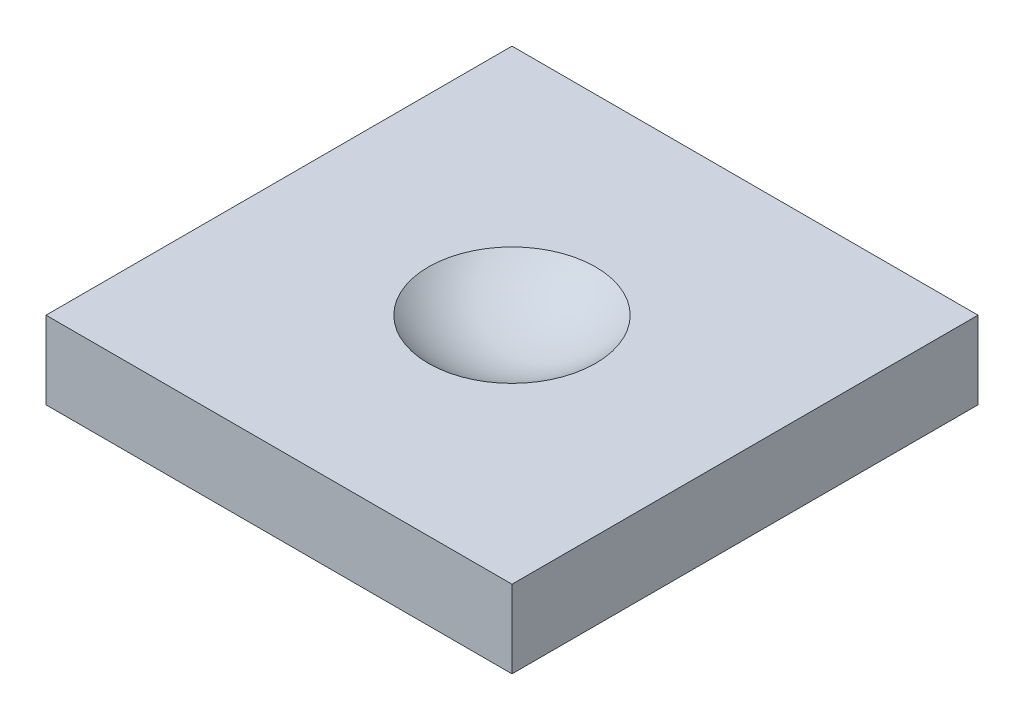
ISO-10303-21;
HEADER;
FILE_DESCRIPTION(('STEP AP214'),'2;1');
FILE_NAME('part.step','',(''),(''),'','','');
FILE_SCHEMA(('AUTOMOTIVE_DESIGN { 1 0 10303 214 1 1 1 1 }'));
ENDSEC;
DATA;
#1=APPLICATION_CONTEXT('core data for automotive mechanical design processes');
#2=APPLICATION_PROTOCOL_DEFINITION('international standard','automotive_design',2000,#1);
#3=PRODUCT_CONTEXT('',#1,'mechanical');
#4=PRODUCT('Part','Part','',(#3));
#5=PRODUCT_RELATED_PRODUCT_CATEGORY('part','',(#4));
#6=PRODUCT_DEFINITION_FORMATION('','',#4);
#7=PRODUCT_DEFINITION_CONTEXT('part definition',#1,'design');
#8=PRODUCT_DEFINITION('design','',#6,#7);
#9=PRODUCT_DEFINITION_SHAPE('','',#8);
#10=(LENGTH_UNIT() NAMED_UNIT(*) SI_UNIT(.MILLI.,.METRE.));
#11=(NAMED_UNIT(*) PLANE_ANGLE_UNIT() SI_UNIT($,.RADIAN.));
#12=(NAMED_UNIT(*) SI_UNIT($,.STERADIAN.) SOLID_ANGLE_UNIT());
#13=UNCERTAINTY_MEASURE_WITH_UNIT(LENGTH_MEASURE(1.E-05),#10,'distance_accuracy_value','');
#14=(GEOMETRIC_REPRESENTATION_CONTEXT(3) GLOBAL_UNCERTAINTY_ASSIGNED_CONTEXT((#13)) GLOBAL_UNIT_ASSIGNED_CONTEXT((#10,
#11,#12)) REPRESENTATION_CONTEXT('',''));
#15=CARTESIAN_POINT('',(0.,0.,0.));
#16=DIRECTION('',(0.,0.,1.));
#17=DIRECTION('',(1.,0.,0.));
#18=AXIS2_PLACEMENT_3D('',#15,#16,#17);
#19=CARTESIAN_POINT('',(0.,0.,0.));
#20=DIRECTION('',(0.,1.,0.));
#21=DIRECTION('',(0.,0.,1.));
#22=AXIS2_PLACEMENT_3D('',#19,#20,#21);
#23=PLANE('',#22);
#24=DIRECTION('',(1.,0.,0.));
#25=VECTOR('',#24,1.);
#26=CARTESIAN_POINT('',(-60.,0.,60.));
#27=LINE('',#26,#25);
#28=CARTESIAN_POINT('',(-60.,0.,60.));
#29=VERTEX_POINT('',#28);
#30=CARTESIAN_POINT('',(60.,0.,60.));
#31=VERTEX_POINT('',#30);
#32=EDGE_CURVE('E147',#29,#31,#27,.T.);
#33=ORIENTED_EDGE('',*,*,#32,.F.);
#34=DIRECTION('',(0.,0.,-1.));
#35=VECTOR('',#34,1.);
#36=CARTESIAN_POINT('',(-60.,0.,60.));
#37=LINE('',#36,#35);
#38=CARTESIAN_POINT('',(-60.,0.,-60.));
#39=VERTEX_POINT('',#38);
#40=EDGE_CURVE('E155',#29,#39,#37,.T.);
#41=ORIENTED_EDGE('',*,*,#40,.T.);
#42=DIRECTION('',(1.,0.,0.));
#43=VECTOR('',#42,1.);
#44=CARTESIAN_POINT('',(-60.,0.,-60.));
#45=LINE('',#44,#43);
#46=CARTESIAN_POINT('',(60.,0.,-60.));
#47=VERTEX_POINT('',#46);
#48=EDGE_CURVE('E171',#39,#47,#45,.T.);
#49=ORIENTED_EDGE('',*,*,#48,.T.);
#50=DIRECTION('',(0.,0.,-1.));
#51=VECTOR('',#50,1.);
#52=CARTESIAN_POINT('',(60.,0.,60.));
#53=LINE('',#52,#51);
#54=EDGE_CURVE('E167',#31,#47,#53,.T.);
#55=ORIENTED_EDGE('',*,*,#54,.F.);
#56=EDGE_LOOP('',(#33,#41,#49,#55));
#57=FACE_BOUND('',#56,.T.);
#58=DIRECTION('',(-1.,0.,0.));
#59=VECTOR('',#58,1.);
#60=CARTESIAN_POINT('',(49.925,0.,-49.95));
#61=LINE('',#60,#59);
#62=CARTESIAN_POINT('',(49.925,0.,-49.95));
#63=VERTEX_POINT('',#62);
#64=CARTESIAN_POINT('',(-49.925,0.,-49.95));
#65=VERTEX_POINT('',#64);
#66=EDGE_CURVE('E60',#63,#65,#61,.T.);
#67=ORIENTED_EDGE('',*,*,#66,.T.);
#68=DIRECTION('',(0.,0.,1.));
#69=VECTOR('',#68,1.);
#70=CARTESIAN_POINT('',(-49.925,0.,-49.95));
#71=LINE('',#70,#69);
#72=CARTESIAN_POINT('',(-49.925,0.,49.95));
#73=VERTEX_POINT('',#72);
#74=EDGE_CURVE('E140',#65,#73,#71,.T.);
#75=ORIENTED_EDGE('',*,*,#74,.T.);
#76=DIRECTION('',(-1.,0.,0.));
#77=VECTOR('',#76,1.);
#78=CARTESIAN_POINT('',(49.925,0.,49.95));
#79=LINE('',#78,#77);
#80=CARTESIAN_POINT('',(49.925,0.,49.95));
#81=VERTEX_POINT('',#80);
#82=EDGE_CURVE('E325',#81,#73,#79,.T.);
#83=ORIENTED_EDGE('',*,*,#82,.F.);
#84=DIRECTION('',(0.,0.,1.));
#85=VECTOR('',#84,1.);
#86=CARTESIAN_POINT('',(49.925,0.,-49.95));
#87=LINE('',#86,#85);
#88=EDGE_CURVE('E136',#63,#81,#87,.T.);
#89=ORIENTED_EDGE('',*,*,#88,.F.);
#90=EDGE_LOOP('',(#67,#75,#83,#89));
#91=FACE_BOUND('',#90,.T.);
#92=ADVANCED_FACE('F43',(#57,#91),#23,.F.);
#93=CARTESIAN_POINT('',(-60.,20.,60.));
#94=DIRECTION('',(0.,0.,-1.));
#95=DIRECTION('',(-1.,0.,0.));
#96=AXIS2_PLACEMENT_3D('',#93,#94,#95);
#97=PLANE('',#96);
#98=ORIENTED_EDGE('',*,*,#32,.T.);
#99=DIRECTION('',(0.,-1.,0.));
#100=VECTOR('',#99,1.);
#101=CARTESIAN_POINT('',(60.,20.,60.));
#102=LINE('',#101,#100);
#103=CARTESIAN_POINT('',(60.,20.,60.));
#104=VERTEX_POINT('',#103);
#105=EDGE_CURVE('E11',#104,#31,#102,.T.);
#106=ORIENTED_EDGE('',*,*,#105,.F.);
#107=DIRECTION('',(1.,0.,0.));
#108=VECTOR('',#107,1.);
#109=CARTESIAN_POINT('',(-60.,20.,60.));
#110=LINE('',#109,#108);
#111=CARTESIAN_POINT('',(-60.,20.,60.));
#112=VERTEX_POINT('',#111);
#113=EDGE_CURVE('E152',#112,#104,#110,.T.);
#114=ORIENTED_EDGE('',*,*,#113,.F.);
#115=DIRECTION('',(0.,-1.,0.));
#116=VECTOR('',#115,1.);
#117=CARTESIAN_POINT('',(-60.,20.,60.));
#118=LINE('',#117,#116);
#119=EDGE_CURVE('E69',#112,#29,#118,.T.);
#120=ORIENTED_EDGE('',*,*,#119,.T.);
#121=EDGE_LOOP('',(#98,#106,#114,#120));
#122=FACE_BOUND('',#121,.T.);
#123=ADVANCED_FACE('F45',(#122),#97,.F.);
#124=CARTESIAN_POINT('',(60.,20.,60.));
#125=DIRECTION('',(-1.,0.,0.));
#126=DIRECTION('',(0.,0.,1.));
#127=AXIS2_PLACEMENT_3D('',#124,#125,#126);
#128=PLANE('',#127);
#129=ORIENTED_EDGE('',*,*,#54,.T.);
#130=DIRECTION('',(0.,-1.,0.));
#131=VECTOR('',#130,1.);
#132=CARTESIAN_POINT('',(60.,20.,-60.));
#133=LINE('',#132,#131);
#134=CARTESIAN_POINT('',(60.,20.,-60.));
#135=VERTEX_POINT('',#134);
#136=EDGE_CURVE('E53',#135,#47,#133,.T.);
#137=ORIENTED_EDGE('',*,*,#136,.F.);
#138=DIRECTION('',(0.,0.,-1.));
#139=VECTOR('',#138,1.);
#140=CARTESIAN_POINT('',(60.,20.,60.));
#141=LINE('',#140,#139);
#142=EDGE_CURVE('E95',#104,#135,#141,.T.);
#143=ORIENTED_EDGE('',*,*,#142,.F.);
#144=ORIENTED_EDGE('',*,*,#105,.T.);
#145=EDGE_LOOP('',(#129,#137,#143,#144));
#146=FACE_BOUND('',#145,.T.);
#147=ADVANCED_FACE('F188',(#146),#128,.F.);
#148=CARTESIAN_POINT('',(-60.,20.,-60.));
#149=DIRECTION('',(0.,0.,-1.));
#150=DIRECTION('',(-1.,0.,0.));
#151=AXIS2_PLACEMENT_3D('',#148,#149,#150);
#152=PLANE('',#151);
#153=ORIENTED_EDGE('',*,*,#48,.F.);
#154=DIRECTION('',(0.,-1.,0.));
#155=VECTOR('',#154,1.);
#156=CARTESIAN_POINT('',(-60.,20.,-60.));
#157=LINE('',#156,#155);
#158=CARTESIAN_POINT('',(-60.,20.,-60.));
#159=VERTEX_POINT('',#158);
#160=EDGE_CURVE('E180',#159,#39,#157,.T.);
#161=ORIENTED_EDGE('',*,*,#160,.F.);
#162=DIRECTION('',(1.,0.,0.));
#163=VECTOR('',#162,1.);
#164=CARTESIAN_POINT('',(-60.,20.,-60.));
#165=LINE('',#164,#163);
#166=EDGE_CURVE('E158',#159,#135,#165,.T.);
#167=ORIENTED_EDGE('',*,*,#166,.T.);
#168=ORIENTED_EDGE('',*,*,#136,.T.);
#169=EDGE_LOOP('',(#153,#161,#167,#168));
#170=FACE_BOUND('',#169,.T.);
#171=ADVANCED_FACE('F186',(#170),#152,.T.);
#172=CARTESIAN_POINT('',(-60.,20.,60.));
#173=DIRECTION('',(-1.,0.,0.));
#174=DIRECTION('',(0.,0.,1.));
#175=AXIS2_PLACEMENT_3D('',#172,#173,#174);
#176=PLANE('',#175);
#177=ORIENTED_EDGE('',*,*,#40,.F.);
#178=ORIENTED_EDGE('',*,*,#119,.F.);
#179=DIRECTION('',(0.,0.,-1.));
#180=VECTOR('',#179,1.);
#181=CARTESIAN_POINT('',(-60.,20.,60.));
#182=LINE('',#181,#180);
#183=EDGE_CURVE('E162',#112,#159,#182,.T.);
#184=ORIENTED_EDGE('',*,*,#183,.T.);
#185=ORIENTED_EDGE('',*,*,#160,.T.);
#186=EDGE_LOOP('',(#177,#178,#184,#185));
#187=FACE_BOUND('',#186,.T.);
#188=ADVANCED_FACE('F192',(#187),#176,.T.);
#189=CARTESIAN_POINT('',(0.,20.,0.));
#190=DIRECTION('',(0.,1.,0.));
#191=DIRECTION('',(0.,0.,1.));
#192=AXIS2_PLACEMENT_3D('',#189,#190,#191);
#193=PLANE('',#192);
#194=CARTESIAN_POINT('',(0.,20.,0.));
#195=DIRECTION('',(0.,1.,0.));
#196=DIRECTION('',(0.,0.,1.));
#197=AXIS2_PLACEMENT_3D('',#194,#195,#196);
#198=CIRCLE('',#197,21.5232432500309);
#199=CARTESIAN_POINT('',(0.,20.,21.5232432500309));
#200=VERTEX_POINT('',#199);
#201=EDGE_CURVE('E47',#200,#200,#198,.F.);
#202=ORIENTED_EDGE('',*,*,#201,.T.);
#203=EDGE_LOOP('',(#202));
#204=FACE_BOUND('',#203,.T.);
#205=ORIENTED_EDGE('',*,*,#113,.T.);
#206=ORIENTED_EDGE('',*,*,#142,.T.);
#207=ORIENTED_EDGE('',*,*,#166,.F.);
#208=ORIENTED_EDGE('',*,*,#183,.F.);
#209=EDGE_LOOP('',(#205,#206,#207,#208));
#210=FACE_BOUND('',#209,.T.);
#211=ADVANCED_FACE('F195',(#204,#210),#193,.T.);
#212=CARTESIAN_POINT('',(0.,43.,0.));
#213=DIRECTION('',(-1.,0.,0.));
#214=DIRECTION('',(0.,1.,0.));
#215=AXIS2_PLACEMENT_3D('',#212,#213,#214);
#216=SPHERICAL_SURFACE('',#215,31.5);
#217=CARTESIAN_POINT('',(0.,43.,0.));
#218=DIRECTION('',(0.,1.,0.));
#219=DIRECTION('',(0.,0.,1.));
#220=AXIS2_PLACEMENT_3D('',#217,#218,#219);
#221=SPHERICAL_SURFACE('',#220,31.5);
#222=ORIENTED_EDGE('',*,*,#201,.F.);
#223=EDGE_LOOP('',(#222));
#224=FACE_BOUND('',#223,.T.);
#225=ADVANCED_FACE('F224',(#224),#221,.F.);
#226=CARTESIAN_POINT('',(49.925,8.,-49.95));
#227=DIRECTION('',(0.,0.,1.));
#228=DIRECTION('',(1.,0.,0.));
#229=AXIS2_PLACEMENT_3D('',#226,#227,#228);
#230=PLANE('',#229);
#231=ORIENTED_EDGE('',*,*,#66,.F.);
#232=DIRECTION('',(0.,-1.,0.));
#233=VECTOR('',#232,1.);
#234=CARTESIAN_POINT('',(49.925,8.,-49.95));
#235=LINE('',#234,#233);
#236=CARTESIAN_POINT('',(49.925,8.,-49.95));
#237=VERTEX_POINT('',#236);
#238=EDGE_CURVE('E134',#237,#63,#235,.T.);
#239=ORIENTED_EDGE('',*,*,#238,.F.);
#240=DIRECTION('',(-1.,0.,0.));
#241=VECTOR('',#240,1.);
#242=CARTESIAN_POINT('',(49.925,8.,-49.95));
#243=LINE('',#242,#241);
#244=CARTESIAN_POINT('',(-49.925,8.,-49.95));
#245=VERTEX_POINT('',#244);
#246=EDGE_CURVE('E123',#237,#245,#243,.T.);
#247=ORIENTED_EDGE('',*,*,#246,.T.);
#248=DIRECTION('',(0.,-1.,0.));
#249=VECTOR('',#248,1.);
#250=CARTESIAN_POINT('',(-49.925,8.,-49.95));
#251=LINE('',#250,#249);
#252=EDGE_CURVE('E133',#245,#65,#251,.T.);
#253=ORIENTED_EDGE('',*,*,#252,.T.);
#254=EDGE_LOOP('',(#231,#239,#247,#253));
#255=FACE_BOUND('',#254,.T.);
#256=ADVANCED_FACE('F132',(#255),#230,.T.);
#257=CARTESIAN_POINT('',(-49.925,8.,-49.95));
#258=DIRECTION('',(1.,0.,0.));
#259=DIRECTION('',(0.,0.,-1.));
#260=AXIS2_PLACEMENT_3D('',#257,#258,#259);
#261=PLANE('',#260);
#262=ORIENTED_EDGE('',*,*,#74,.F.);
#263=ORIENTED_EDGE('',*,*,#252,.F.);
#264=DIRECTION('',(0.,0.,1.));
#265=VECTOR('',#264,1.);
#266=CARTESIAN_POINT('',(-49.925,8.,-49.95));
#267=LINE('',#266,#265);
#268=CARTESIAN_POINT('',(-49.925,8.,49.95));
#269=VERTEX_POINT('',#268);
#270=EDGE_CURVE('E119',#245,#269,#267,.T.);
#271=ORIENTED_EDGE('',*,*,#270,.T.);
#272=DIRECTION('',(0.,-1.,0.));
#273=VECTOR('',#272,1.);
#274=CARTESIAN_POINT('',(-49.925,8.,49.95));
#275=LINE('',#274,#273);
#276=EDGE_CURVE('E142',#269,#73,#275,.T.);
#277=ORIENTED_EDGE('',*,*,#276,.T.);
#278=EDGE_LOOP('',(#262,#263,#271,#277));
#279=FACE_BOUND('',#278,.T.);
#280=ADVANCED_FACE('F138',(#279),#261,.T.);
#281=CARTESIAN_POINT('',(49.925,8.,49.95));
#282=DIRECTION('',(0.,0.,1.));
#283=DIRECTION('',(1.,0.,0.));
#284=AXIS2_PLACEMENT_3D('',#281,#282,#283);
#285=PLANE('',#284);
#286=ORIENTED_EDGE('',*,*,#82,.T.);
#287=ORIENTED_EDGE('',*,*,#276,.F.);
#288=DIRECTION('',(-1.,0.,0.));
#289=VECTOR('',#288,1.);
#290=CARTESIAN_POINT('',(49.925,8.,49.95));
#291=LINE('',#290,#289);
#292=CARTESIAN_POINT('',(49.925,8.,49.95));
#293=VERTEX_POINT('',#292);
#294=EDGE_CURVE('E126',#293,#269,#291,.T.);
#295=ORIENTED_EDGE('',*,*,#294,.F.);
#296=DIRECTION('',(0.,-1.,0.));
#297=VECTOR('',#296,1.);
#298=CARTESIAN_POINT('',(49.925,8.,49.95));
#299=LINE('',#298,#297);
#300=EDGE_CURVE('E148',#293,#81,#299,.T.);
#301=ORIENTED_EDGE('',*,*,#300,.T.);
#302=EDGE_LOOP('',(#286,#287,#295,#301));
#303=FACE_BOUND('',#302,.T.);
#304=ADVANCED_FACE('F243',(#303),#285,.F.);
#305=CARTESIAN_POINT('',(49.925,8.,-49.95));
#306=DIRECTION('',(1.,0.,0.));
#307=DIRECTION('',(0.,0.,-1.));
#308=AXIS2_PLACEMENT_3D('',#305,#306,#307);
#309=PLANE('',#308);
#310=ORIENTED_EDGE('',*,*,#88,.T.);
#311=ORIENTED_EDGE('',*,*,#300,.F.);
#312=DIRECTION('',(0.,0.,1.));
#313=VECTOR('',#312,1.);
#314=CARTESIAN_POINT('',(49.925,8.,-49.95));
#315=LINE('',#314,#313);
#316=EDGE_CURVE('E335',#237,#293,#315,.T.);
#317=ORIENTED_EDGE('',*,*,#316,.F.);
#318=ORIENTED_EDGE('',*,*,#238,.T.);
#319=EDGE_LOOP('',(#310,#311,#317,#318));
#320=FACE_BOUND('',#319,.T.);
#321=ADVANCED_FACE('F250',(#320),#309,.F.);
#322=CARTESIAN_POINT('',(0.,8.,0.));
#323=DIRECTION('',(0.,1.,0.));
#324=DIRECTION('',(0.,0.,1.));
#325=AXIS2_PLACEMENT_3D('',#322,#323,#324);
#326=PLANE('',#325);
#327=ORIENTED_EDGE('',*,*,#246,.F.);
#328=ORIENTED_EDGE('',*,*,#316,.T.);
#329=ORIENTED_EDGE('',*,*,#294,.T.);
#330=ORIENTED_EDGE('',*,*,#270,.F.);
#331=EDGE_LOOP('',(#327,#328,#329,#330));
#332=FACE_BOUND('',#331,.T.);
#333=ADVANCED_FACE('F121',(#332),#326,.F.);
#334=CLOSED_SHELL('',(#92,#123,#147,#171,#188,#211,#225,#256,#280,#304,#321,#333));
#335=MANIFOLD_SOLID_BREP('B2',#334);
#336=ADVANCED_BREP_SHAPE_REPRESENTATION('',(#18,#335),#14);
#337=SHAPE_DEFINITION_REPRESENTATION(#9,#336);
ENDSEC;
END-ISO-10303-21;
